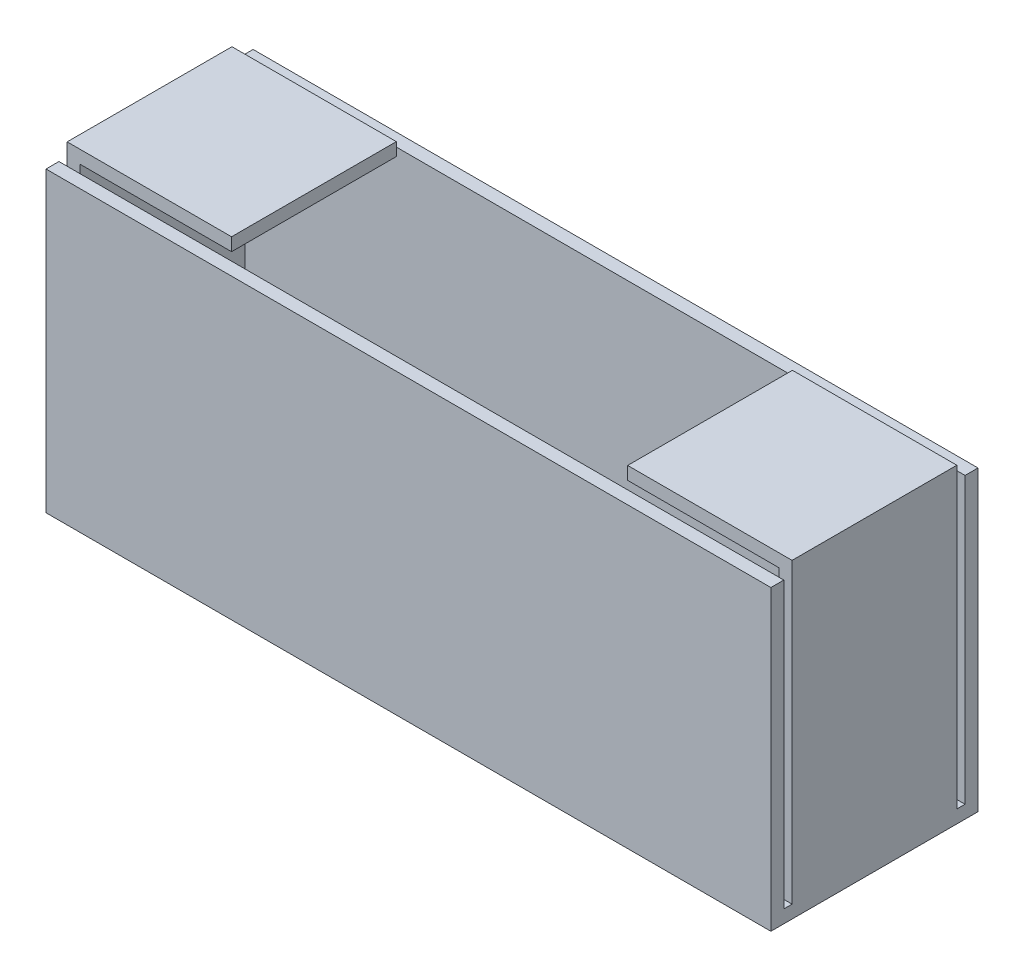
ISO-10303-21;
HEADER;
FILE_DESCRIPTION(('STEP AP214'),'2;1');
FILE_NAME('part.step','',(''),(''),'','','');
FILE_SCHEMA(('AUTOMOTIVE_DESIGN { 1 0 10303 214 1 1 1 1 }'));
ENDSEC;
DATA;
#1=APPLICATION_CONTEXT('core data for automotive mechanical design processes');
#2=APPLICATION_PROTOCOL_DEFINITION('international standard','automotive_design',2000,#1);
#3=PRODUCT_CONTEXT('',#1,'mechanical');
#4=PRODUCT('Part','Part','',(#3));
#5=PRODUCT_RELATED_PRODUCT_CATEGORY('part','',(#4));
#6=PRODUCT_DEFINITION_FORMATION('','',#4);
#7=PRODUCT_DEFINITION_CONTEXT('part definition',#1,'design');
#8=PRODUCT_DEFINITION('design','',#6,#7);
#9=PRODUCT_DEFINITION_SHAPE('','',#8);
#10=(LENGTH_UNIT() NAMED_UNIT(*) SI_UNIT(.MILLI.,.METRE.));
#11=(NAMED_UNIT(*) PLANE_ANGLE_UNIT() SI_UNIT($,.RADIAN.));
#12=(NAMED_UNIT(*) SI_UNIT($,.STERADIAN.) SOLID_ANGLE_UNIT());
#13=UNCERTAINTY_MEASURE_WITH_UNIT(LENGTH_MEASURE(1.E-05),#10,'distance_accuracy_value','');
#14=(GEOMETRIC_REPRESENTATION_CONTEXT(3) GLOBAL_UNCERTAINTY_ASSIGNED_CONTEXT((#13)) GLOBAL_UNIT_ASSIGNED_CONTEXT((#10,
#11,#12)) REPRESENTATION_CONTEXT('',''));
#15=CARTESIAN_POINT('',(0.,0.,0.));
#16=DIRECTION('',(0.,0.,1.));
#17=DIRECTION('',(1.,0.,0.));
#18=AXIS2_PLACEMENT_3D('',#15,#16,#17);
#19=CARTESIAN_POINT('',(0.,1.,0.));
#20=DIRECTION('',(0.,-1.,0.));
#21=DIRECTION('',(0.,0.,-1.));
#22=AXIS2_PLACEMENT_3D('',#19,#20,#21);
#23=PLANE('',#22);
#24=DIRECTION('',(1.,0.,0.));
#25=VECTOR('',#24,1.);
#26=CARTESIAN_POINT('',(-28.,1.,6.365));
#27=LINE('',#26,#25);
#28=CARTESIAN_POINT('',(-28.,1.,6.365));
#29=VERTEX_POINT('',#28);
#30=CARTESIAN_POINT('',(-27.,1.,6.365));
#31=VERTEX_POINT('',#30);
#32=EDGE_CURVE('E237',#29,#31,#27,.T.);
#33=ORIENTED_EDGE('',*,*,#32,.F.);
#34=DIRECTION('',(0.,0.,1.));
#35=VECTOR('',#34,1.);
#36=CARTESIAN_POINT('',(-28.,1.,8.));
#37=LINE('',#36,#35);
#38=CARTESIAN_POINT('',(-28.,1.,7.));
#39=VERTEX_POINT('',#38);
#40=EDGE_CURVE('E37',#29,#39,#37,.T.);
#41=ORIENTED_EDGE('',*,*,#40,.T.);
#42=DIRECTION('',(1.,0.,0.));
#43=VECTOR('',#42,1.);
#44=CARTESIAN_POINT('',(0.,1.,7.));
#45=LINE('',#44,#43);
#46=CARTESIAN_POINT('',(28.,1.,7.));
#47=VERTEX_POINT('',#46);
#48=EDGE_CURVE('E292',#39,#47,#45,.T.);
#49=ORIENTED_EDGE('',*,*,#48,.T.);
#50=DIRECTION('',(0.,0.,-1.));
#51=VECTOR('',#50,1.);
#52=CARTESIAN_POINT('',(28.,1.,8.));
#53=LINE('',#52,#51);
#54=CARTESIAN_POINT('',(28.,1.,6.365));
#55=VERTEX_POINT('',#54);
#56=EDGE_CURVE('E312',#47,#55,#53,.T.);
#57=ORIENTED_EDGE('',*,*,#56,.T.);
#58=DIRECTION('',(1.,0.,0.));
#59=VECTOR('',#58,1.);
#60=CARTESIAN_POINT('',(28.,1.,6.365));
#61=LINE('',#60,#59);
#62=CARTESIAN_POINT('',(27.,1.,6.365));
#63=VERTEX_POINT('',#62);
#64=EDGE_CURVE('E261',#63,#55,#61,.T.);
#65=ORIENTED_EDGE('',*,*,#64,.F.);
#66=DIRECTION('',(0.,0.,1.));
#67=VECTOR('',#66,1.);
#68=CARTESIAN_POINT('',(27.,1.,-6.365));
#69=LINE('',#68,#67);
#70=CARTESIAN_POINT('',(27.,1.,-6.365));
#71=VERTEX_POINT('',#70);
#72=EDGE_CURVE('E263',#71,#63,#69,.T.);
#73=ORIENTED_EDGE('',*,*,#72,.F.);
#74=DIRECTION('',(-1.,0.,0.));
#75=VECTOR('',#74,1.);
#76=CARTESIAN_POINT('',(28.,1.,-6.365));
#77=LINE('',#76,#75);
#78=CARTESIAN_POINT('',(28.,1.,-6.365));
#79=VERTEX_POINT('',#78);
#80=EDGE_CURVE('E256',#79,#71,#77,.T.);
#81=ORIENTED_EDGE('',*,*,#80,.F.);
#82=CARTESIAN_POINT('',(28.,1.,-7.));
#83=VERTEX_POINT('',#82);
#84=EDGE_CURVE('E180',#79,#83,#53,.T.);
#85=ORIENTED_EDGE('',*,*,#84,.T.);
#86=DIRECTION('',(-1.,0.,0.));
#87=VECTOR('',#86,1.);
#88=CARTESIAN_POINT('',(0.,1.,-7.00000000000002));
#89=LINE('',#88,#87);
#90=CARTESIAN_POINT('',(-28.,1.,-7.));
#91=VERTEX_POINT('',#90);
#92=EDGE_CURVE('E183',#83,#91,#89,.T.);
#93=ORIENTED_EDGE('',*,*,#92,.T.);
#94=CARTESIAN_POINT('',(-28.,1.,-6.365));
#95=VERTEX_POINT('',#94);
#96=EDGE_CURVE('E322',#91,#95,#37,.T.);
#97=ORIENTED_EDGE('',*,*,#96,.T.);
#98=DIRECTION('',(-1.,0.,0.));
#99=VECTOR('',#98,1.);
#100=CARTESIAN_POINT('',(-28.,1.,-6.365));
#101=LINE('',#100,#99);
#102=CARTESIAN_POINT('',(-27.,1.,-6.365));
#103=VERTEX_POINT('',#102);
#104=EDGE_CURVE('E56',#103,#95,#101,.T.);
#105=ORIENTED_EDGE('',*,*,#104,.F.);
#106=DIRECTION('',(0.,0.,-1.));
#107=VECTOR('',#106,1.);
#108=CARTESIAN_POINT('',(-27.,1.,-6.365));
#109=LINE('',#108,#107);
#110=EDGE_CURVE('E51',#31,#103,#109,.T.);
#111=ORIENTED_EDGE('',*,*,#110,.F.);
#112=EDGE_LOOP('',(#33,#41,#49,#57,#65,#73,#81,#85,#93,#97,#105,#111));
#113=FACE_BOUND('',#112,.T.);
#114=ADVANCED_FACE('F33',(#113),#23,.F.);
#115=CARTESIAN_POINT('',(28.,1.,8.));
#116=DIRECTION('',(-1.,0.,0.));
#117=DIRECTION('',(0.,0.,1.));
#118=AXIS2_PLACEMENT_3D('',#115,#116,#117);
#119=PLANE('',#118);
#120=DIRECTION('',(0.,0.,-1.));
#121=VECTOR('',#120,1.);
#122=CARTESIAN_POINT('',(28.,0.,8.));
#123=LINE('',#122,#121);
#124=CARTESIAN_POINT('',(28.,0.,8.));
#125=VERTEX_POINT('',#124);
#126=CARTESIAN_POINT('',(28.,0.,-8.));
#127=VERTEX_POINT('',#126);
#128=EDGE_CURVE('E319',#125,#127,#123,.T.);
#129=ORIENTED_EDGE('',*,*,#128,.T.);
#130=DIRECTION('',(0.,-1.,0.));
#131=VECTOR('',#130,1.);
#132=CARTESIAN_POINT('',(28.,1.,-8.));
#133=LINE('',#132,#131);
#134=CARTESIAN_POINT('',(28.,23.,-8.));
#135=VERTEX_POINT('',#134);
#136=EDGE_CURVE('E11',#135,#127,#133,.T.);
#137=ORIENTED_EDGE('',*,*,#136,.F.);
#138=DIRECTION('',(0.,0.,-1.));
#139=VECTOR('',#138,1.);
#140=CARTESIAN_POINT('',(28.,23.,0.));
#141=LINE('',#140,#139);
#142=CARTESIAN_POINT('',(28.,23.,-7.));
#143=VERTEX_POINT('',#142);
#144=EDGE_CURVE('E277',#143,#135,#141,.T.);
#145=ORIENTED_EDGE('',*,*,#144,.F.);
#146=DIRECTION('',(0.,-1.,0.));
#147=VECTOR('',#146,1.);
#148=CARTESIAN_POINT('',(28.,23.,-7.));
#149=LINE('',#148,#147);
#150=EDGE_CURVE('E290',#143,#83,#149,.T.);
#151=ORIENTED_EDGE('',*,*,#150,.T.);
#152=ORIENTED_EDGE('',*,*,#84,.F.);
#153=DIRECTION('',(0.,-1.,0.));
#154=VECTOR('',#153,1.);
#155=CARTESIAN_POINT('',(28.,23.,-6.365));
#156=LINE('',#155,#154);
#157=CARTESIAN_POINT('',(28.,24.,-6.365));
#158=VERTEX_POINT('',#157);
#159=EDGE_CURVE('E173',#158,#79,#156,.T.);
#160=ORIENTED_EDGE('',*,*,#159,.F.);
#161=DIRECTION('',(0.,0.,-1.));
#162=VECTOR('',#161,1.);
#163=CARTESIAN_POINT('',(28.,24.,-6.365));
#164=LINE('',#163,#162);
#165=CARTESIAN_POINT('',(28.,24.,6.365));
#166=VERTEX_POINT('',#165);
#167=EDGE_CURVE('E178',#166,#158,#164,.T.);
#168=ORIENTED_EDGE('',*,*,#167,.F.);
#169=DIRECTION('',(0.,-1.,0.));
#170=VECTOR('',#169,1.);
#171=CARTESIAN_POINT('',(28.,23.,6.365));
#172=LINE('',#171,#170);
#173=EDGE_CURVE('E260',#166,#55,#172,.T.);
#174=ORIENTED_EDGE('',*,*,#173,.T.);
#175=ORIENTED_EDGE('',*,*,#56,.F.);
#176=DIRECTION('',(0.,-1.,0.));
#177=VECTOR('',#176,1.);
#178=CARTESIAN_POINT('',(28.,23.,7.));
#179=LINE('',#178,#177);
#180=CARTESIAN_POINT('',(28.,23.,7.));
#181=VERTEX_POINT('',#180);
#182=EDGE_CURVE('E304',#181,#47,#179,.T.);
#183=ORIENTED_EDGE('',*,*,#182,.F.);
#184=DIRECTION('',(0.,0.,-1.));
#185=VECTOR('',#184,1.);
#186=CARTESIAN_POINT('',(28.,23.,0.));
#187=LINE('',#186,#185);
#188=CARTESIAN_POINT('',(28.,23.,8.));
#189=VERTEX_POINT('',#188);
#190=EDGE_CURVE('E302',#189,#181,#187,.T.);
#191=ORIENTED_EDGE('',*,*,#190,.F.);
#192=DIRECTION('',(0.,-1.,0.));
#193=VECTOR('',#192,1.);
#194=CARTESIAN_POINT('',(28.,1.,8.));
#195=LINE('',#194,#193);
#196=EDGE_CURVE('E323',#189,#125,#195,.T.);
#197=ORIENTED_EDGE('',*,*,#196,.T.);
#198=EDGE_LOOP('',(#129,#137,#145,#151,#152,#160,#168,#174,#175,#183,#191,#197));
#199=FACE_BOUND('',#198,.T.);
#200=ADVANCED_FACE('F35',(#199),#119,.F.);
#201=CARTESIAN_POINT('',(-28.,1.,-8.));
#202=DIRECTION('',(0.,0.,1.));
#203=DIRECTION('',(1.,0.,0.));
#204=AXIS2_PLACEMENT_3D('',#201,#202,#203);
#205=PLANE('',#204);
#206=DIRECTION('',(-1.,0.,0.));
#207=VECTOR('',#206,1.);
#208=CARTESIAN_POINT('',(-28.,0.,-8.));
#209=LINE('',#208,#207);
#210=CARTESIAN_POINT('',(-28.,0.,-8.));
#211=VERTEX_POINT('',#210);
#212=EDGE_CURVE('E328',#127,#211,#209,.T.);
#213=ORIENTED_EDGE('',*,*,#212,.T.);
#214=DIRECTION('',(0.,-1.,0.));
#215=VECTOR('',#214,1.);
#216=CARTESIAN_POINT('',(-28.,1.,-8.));
#217=LINE('',#216,#215);
#218=CARTESIAN_POINT('',(-28.,23.,-8.));
#219=VERTEX_POINT('',#218);
#220=EDGE_CURVE('E43',#219,#211,#217,.T.);
#221=ORIENTED_EDGE('',*,*,#220,.F.);
#222=DIRECTION('',(-1.,0.,0.));
#223=VECTOR('',#222,1.);
#224=CARTESIAN_POINT('',(0.,23.,-8.));
#225=LINE('',#224,#223);
#226=EDGE_CURVE('E280',#135,#219,#225,.T.);
#227=ORIENTED_EDGE('',*,*,#226,.F.);
#228=ORIENTED_EDGE('',*,*,#136,.T.);
#229=EDGE_LOOP('',(#213,#221,#227,#228));
#230=FACE_BOUND('',#229,.T.);
#231=ADVANCED_FACE('F411',(#230),#205,.F.);
#232=CARTESIAN_POINT('',(-28.,1.,8.));
#233=DIRECTION('',(1.,0.,0.));
#234=DIRECTION('',(0.,0.,-1.));
#235=AXIS2_PLACEMENT_3D('',#232,#233,#234);
#236=PLANE('',#235);
#237=DIRECTION('',(0.,0.,1.));
#238=VECTOR('',#237,1.);
#239=CARTESIAN_POINT('',(-28.,0.,8.));
#240=LINE('',#239,#238);
#241=CARTESIAN_POINT('',(-28.,0.,8.));
#242=VERTEX_POINT('',#241);
#243=EDGE_CURVE('E330',#211,#242,#240,.T.);
#244=ORIENTED_EDGE('',*,*,#243,.T.);
#245=DIRECTION('',(0.,-1.,0.));
#246=VECTOR('',#245,1.);
#247=CARTESIAN_POINT('',(-28.,1.,8.));
#248=LINE('',#247,#246);
#249=CARTESIAN_POINT('',(-28.,23.,8.));
#250=VERTEX_POINT('',#249);
#251=EDGE_CURVE('E336',#250,#242,#248,.T.);
#252=ORIENTED_EDGE('',*,*,#251,.F.);
#253=DIRECTION('',(0.,0.,1.));
#254=VECTOR('',#253,1.);
#255=CARTESIAN_POINT('',(-28.,23.,0.));
#256=LINE('',#255,#254);
#257=CARTESIAN_POINT('',(-28.,23.,7.));
#258=VERTEX_POINT('',#257);
#259=EDGE_CURVE('E296',#258,#250,#256,.T.);
#260=ORIENTED_EDGE('',*,*,#259,.F.);
#261=DIRECTION('',(0.,-1.,0.));
#262=VECTOR('',#261,1.);
#263=CARTESIAN_POINT('',(-28.,23.,7.));
#264=LINE('',#263,#262);
#265=EDGE_CURVE('E314',#258,#39,#264,.T.);
#266=ORIENTED_EDGE('',*,*,#265,.T.);
#267=ORIENTED_EDGE('',*,*,#40,.F.);
#268=DIRECTION('',(0.,-1.,0.));
#269=VECTOR('',#268,1.);
#270=CARTESIAN_POINT('',(-28.,23.,6.365));
#271=LINE('',#270,#269);
#272=CARTESIAN_POINT('',(-28.,24.,6.365));
#273=VERTEX_POINT('',#272);
#274=EDGE_CURVE('E253',#273,#29,#271,.T.);
#275=ORIENTED_EDGE('',*,*,#274,.F.);
#276=DIRECTION('',(0.,0.,1.));
#277=VECTOR('',#276,1.);
#278=CARTESIAN_POINT('',(-28.,24.,6.365));
#279=LINE('',#278,#277);
#280=CARTESIAN_POINT('',(-28.,24.,-6.365));
#281=VERTEX_POINT('',#280);
#282=EDGE_CURVE('E215',#281,#273,#279,.T.);
#283=ORIENTED_EDGE('',*,*,#282,.F.);
#284=DIRECTION('',(0.,-1.,0.));
#285=VECTOR('',#284,1.);
#286=CARTESIAN_POINT('',(-28.,23.,-6.365));
#287=LINE('',#286,#285);
#288=EDGE_CURVE('E241',#281,#95,#287,.T.);
#289=ORIENTED_EDGE('',*,*,#288,.T.);
#290=ORIENTED_EDGE('',*,*,#96,.F.);
#291=DIRECTION('',(0.,-1.,0.));
#292=VECTOR('',#291,1.);
#293=CARTESIAN_POINT('',(-28.,23.,-7.));
#294=LINE('',#293,#292);
#295=CARTESIAN_POINT('',(-28.,23.,-7.));
#296=VERTEX_POINT('',#295);
#297=EDGE_CURVE('E285',#296,#91,#294,.T.);
#298=ORIENTED_EDGE('',*,*,#297,.F.);
#299=DIRECTION('',(0.,0.,1.));
#300=VECTOR('',#299,1.);
#301=CARTESIAN_POINT('',(-28.,23.,0.));
#302=LINE('',#301,#300);
#303=EDGE_CURVE('E283',#219,#296,#302,.T.);
#304=ORIENTED_EDGE('',*,*,#303,.F.);
#305=ORIENTED_EDGE('',*,*,#220,.T.);
#306=EDGE_LOOP('',(#244,#252,#260,#266,#267,#275,#283,#289,#290,#298,#304,#305));
#307=FACE_BOUND('',#306,.T.);
#308=ADVANCED_FACE('F343',(#307),#236,.F.);
#309=CARTESIAN_POINT('',(-28.,1.,8.));
#310=DIRECTION('',(0.,0.,-1.));
#311=DIRECTION('',(-1.,0.,0.));
#312=AXIS2_PLACEMENT_3D('',#309,#310,#311);
#313=PLANE('',#312);
#314=DIRECTION('',(1.,0.,0.));
#315=VECTOR('',#314,1.);
#316=CARTESIAN_POINT('',(-28.,0.,8.));
#317=LINE('',#316,#315);
#318=EDGE_CURVE('E332',#242,#125,#317,.T.);
#319=ORIENTED_EDGE('',*,*,#318,.T.);
#320=ORIENTED_EDGE('',*,*,#196,.F.);
#321=DIRECTION('',(1.,0.,0.));
#322=VECTOR('',#321,1.);
#323=CARTESIAN_POINT('',(0.,23.,8.));
#324=LINE('',#323,#322);
#325=EDGE_CURVE('E299',#250,#189,#324,.T.);
#326=ORIENTED_EDGE('',*,*,#325,.F.);
#327=ORIENTED_EDGE('',*,*,#251,.T.);
#328=EDGE_LOOP('',(#319,#320,#326,#327));
#329=FACE_BOUND('',#328,.T.);
#330=ADVANCED_FACE('F352',(#329),#313,.F.);
#331=CARTESIAN_POINT('',(0.,0.,0.));
#332=DIRECTION('',(0.,-1.,0.));
#333=DIRECTION('',(0.,0.,-1.));
#334=AXIS2_PLACEMENT_3D('',#331,#332,#333);
#335=PLANE('',#334);
#336=ORIENTED_EDGE('',*,*,#128,.F.);
#337=ORIENTED_EDGE('',*,*,#318,.F.);
#338=ORIENTED_EDGE('',*,*,#243,.F.);
#339=ORIENTED_EDGE('',*,*,#212,.F.);
#340=EDGE_LOOP('',(#336,#337,#338,#339));
#341=FACE_BOUND('',#340,.T.);
#342=ADVANCED_FACE('F350',(#341),#335,.T.);
#343=CARTESIAN_POINT('',(0.,23.,7.));
#344=DIRECTION('',(0.,0.,-1.));
#345=DIRECTION('',(-1.,0.,0.));
#346=AXIS2_PLACEMENT_3D('',#343,#344,#345);
#347=PLANE('',#346);
#348=ORIENTED_EDGE('',*,*,#48,.F.);
#349=ORIENTED_EDGE('',*,*,#265,.F.);
#350=DIRECTION('',(1.,0.,0.));
#351=VECTOR('',#350,1.);
#352=CARTESIAN_POINT('',(0.,23.,7.));
#353=LINE('',#352,#351);
#354=EDGE_CURVE('E293',#258,#181,#353,.T.);
#355=ORIENTED_EDGE('',*,*,#354,.T.);
#356=ORIENTED_EDGE('',*,*,#182,.T.);
#357=EDGE_LOOP('',(#348,#349,#355,#356));
#358=FACE_BOUND('',#357,.T.);
#359=ADVANCED_FACE('F363',(#358),#347,.T.);
#360=CARTESIAN_POINT('',(0.,23.,0.));
#361=DIRECTION('',(0.,1.,0.));
#362=DIRECTION('',(0.,0.,1.));
#363=AXIS2_PLACEMENT_3D('',#360,#361,#362);
#364=PLANE('',#363);
#365=ORIENTED_EDGE('',*,*,#354,.F.);
#366=ORIENTED_EDGE('',*,*,#259,.T.);
#367=ORIENTED_EDGE('',*,*,#325,.T.);
#368=ORIENTED_EDGE('',*,*,#190,.T.);
#369=EDGE_LOOP('',(#365,#366,#367,#368));
#370=FACE_BOUND('',#369,.T.);
#371=ADVANCED_FACE('F359',(#370),#364,.T.);
#372=CARTESIAN_POINT('',(0.,23.,-7.00000000000002));
#373=DIRECTION('',(0.,0.,1.));
#374=DIRECTION('',(1.,0.,0.));
#375=AXIS2_PLACEMENT_3D('',#372,#373,#374);
#376=PLANE('',#375);
#377=ORIENTED_EDGE('',*,*,#92,.F.);
#378=ORIENTED_EDGE('',*,*,#150,.F.);
#379=DIRECTION('',(-1.,0.,0.));
#380=VECTOR('',#379,1.);
#381=CARTESIAN_POINT('',(0.,23.,-7.00000000000002));
#382=LINE('',#381,#380);
#383=EDGE_CURVE('E274',#143,#296,#382,.T.);
#384=ORIENTED_EDGE('',*,*,#383,.T.);
#385=ORIENTED_EDGE('',*,*,#297,.T.);
#386=EDGE_LOOP('',(#377,#378,#384,#385));
#387=FACE_BOUND('',#386,.T.);
#388=ADVANCED_FACE('F368',(#387),#376,.T.);
#389=CARTESIAN_POINT('',(0.,23.,0.));
#390=DIRECTION('',(0.,1.,0.));
#391=DIRECTION('',(0.,0.,1.));
#392=AXIS2_PLACEMENT_3D('',#389,#390,#391);
#393=PLANE('',#392);
#394=ORIENTED_EDGE('',*,*,#383,.F.);
#395=ORIENTED_EDGE('',*,*,#144,.T.);
#396=ORIENTED_EDGE('',*,*,#226,.T.);
#397=ORIENTED_EDGE('',*,*,#303,.T.);
#398=EDGE_LOOP('',(#394,#395,#396,#397));
#399=FACE_BOUND('',#398,.T.);
#400=ADVANCED_FACE('F424',(#399),#393,.T.);
#401=CARTESIAN_POINT('',(28.,23.,-6.365));
#402=DIRECTION('',(0.,0.,1.));
#403=DIRECTION('',(1.,0.,0.));
#404=AXIS2_PLACEMENT_3D('',#401,#402,#403);
#405=PLANE('',#404);
#406=ORIENTED_EDGE('',*,*,#80,.T.);
#407=DIRECTION('',(0.,-1.,0.));
#408=VECTOR('',#407,1.);
#409=CARTESIAN_POINT('',(27.,23.,-6.365));
#410=LINE('',#409,#408);
#411=CARTESIAN_POINT('',(27.,23.,-6.365));
#412=VERTEX_POINT('',#411);
#413=EDGE_CURVE('E184',#412,#71,#410,.T.);
#414=ORIENTED_EDGE('',*,*,#413,.F.);
#415=DIRECTION('',(-1.,0.,0.));
#416=VECTOR('',#415,1.);
#417=CARTESIAN_POINT('',(28.,23.,-6.365));
#418=LINE('',#417,#416);
#419=CARTESIAN_POINT('',(15.3,23.,-6.365));
#420=VERTEX_POINT('',#419);
#421=EDGE_CURVE('E208',#412,#420,#418,.T.);
#422=ORIENTED_EDGE('',*,*,#421,.T.);
#423=DIRECTION('',(0.,-1.,0.));
#424=VECTOR('',#423,1.);
#425=CARTESIAN_POINT('',(15.3,24.,-6.365));
#426=LINE('',#425,#424);
#427=CARTESIAN_POINT('',(15.3,24.,-6.365));
#428=VERTEX_POINT('',#427);
#429=EDGE_CURVE('E190',#428,#420,#426,.T.);
#430=ORIENTED_EDGE('',*,*,#429,.F.);
#431=DIRECTION('',(-1.,0.,0.));
#432=VECTOR('',#431,1.);
#433=CARTESIAN_POINT('',(28.,24.,-6.365));
#434=LINE('',#433,#432);
#435=EDGE_CURVE('E187',#158,#428,#434,.T.);
#436=ORIENTED_EDGE('',*,*,#435,.F.);
#437=ORIENTED_EDGE('',*,*,#159,.T.);
#438=EDGE_LOOP('',(#406,#414,#422,#430,#436,#437));
#439=FACE_BOUND('',#438,.T.);
#440=ADVANCED_FACE('F188',(#439),#405,.F.);
#441=CARTESIAN_POINT('',(27.,23.,-6.365));
#442=DIRECTION('',(1.,0.,0.));
#443=DIRECTION('',(0.,0.,-1.));
#444=AXIS2_PLACEMENT_3D('',#441,#442,#443);
#445=PLANE('',#444);
#446=ORIENTED_EDGE('',*,*,#72,.T.);
#447=DIRECTION('',(0.,-1.,0.));
#448=VECTOR('',#447,1.);
#449=CARTESIAN_POINT('',(27.,23.,6.365));
#450=LINE('',#449,#448);
#451=CARTESIAN_POINT('',(27.,23.,6.365));
#452=VERTEX_POINT('',#451);
#453=EDGE_CURVE('E269',#452,#63,#450,.T.);
#454=ORIENTED_EDGE('',*,*,#453,.F.);
#455=DIRECTION('',(0.,0.,1.));
#456=VECTOR('',#455,1.);
#457=CARTESIAN_POINT('',(27.,23.,-6.365));
#458=LINE('',#457,#456);
#459=EDGE_CURVE('E257',#412,#452,#458,.T.);
#460=ORIENTED_EDGE('',*,*,#459,.F.);
#461=ORIENTED_EDGE('',*,*,#413,.T.);
#462=EDGE_LOOP('',(#446,#454,#460,#461));
#463=FACE_BOUND('',#462,.T.);
#464=ADVANCED_FACE('F430',(#463),#445,.F.);
#465=CARTESIAN_POINT('',(28.,23.,6.365));
#466=DIRECTION('',(0.,0.,-1.));
#467=DIRECTION('',(-1.,0.,0.));
#468=AXIS2_PLACEMENT_3D('',#465,#466,#467);
#469=PLANE('',#468);
#470=ORIENTED_EDGE('',*,*,#64,.T.);
#471=ORIENTED_EDGE('',*,*,#173,.F.);
#472=DIRECTION('',(1.,0.,0.));
#473=VECTOR('',#472,1.);
#474=CARTESIAN_POINT('',(28.,24.,6.365));
#475=LINE('',#474,#473);
#476=CARTESIAN_POINT('',(15.3,24.,6.365));
#477=VERTEX_POINT('',#476);
#478=EDGE_CURVE('E198',#477,#166,#475,.T.);
#479=ORIENTED_EDGE('',*,*,#478,.F.);
#480=DIRECTION('',(0.,-1.,0.));
#481=VECTOR('',#480,1.);
#482=CARTESIAN_POINT('',(15.3,24.,6.365));
#483=LINE('',#482,#481);
#484=CARTESIAN_POINT('',(15.3,23.,6.365));
#485=VERTEX_POINT('',#484);
#486=EDGE_CURVE('E207',#477,#485,#483,.T.);
#487=ORIENTED_EDGE('',*,*,#486,.T.);
#488=DIRECTION('',(1.,0.,0.));
#489=VECTOR('',#488,1.);
#490=CARTESIAN_POINT('',(28.,23.,6.365));
#491=LINE('',#490,#489);
#492=EDGE_CURVE('E199',#485,#452,#491,.T.);
#493=ORIENTED_EDGE('',*,*,#492,.T.);
#494=ORIENTED_EDGE('',*,*,#453,.T.);
#495=EDGE_LOOP('',(#470,#471,#479,#487,#493,#494));
#496=FACE_BOUND('',#495,.T.);
#497=ADVANCED_FACE('F468',(#496),#469,.F.);
#498=CARTESIAN_POINT('',(-28.,23.,6.365));
#499=DIRECTION('',(0.,0.,-1.));
#500=DIRECTION('',(-1.,0.,0.));
#501=AXIS2_PLACEMENT_3D('',#498,#499,#500);
#502=PLANE('',#501);
#503=ORIENTED_EDGE('',*,*,#32,.T.);
#504=DIRECTION('',(0.,-1.,0.));
#505=VECTOR('',#504,1.);
#506=CARTESIAN_POINT('',(-27.,23.,6.365));
#507=LINE('',#506,#505);
#508=CARTESIAN_POINT('',(-27.,23.,6.365));
#509=VERTEX_POINT('',#508);
#510=EDGE_CURVE('E250',#509,#31,#507,.T.);
#511=ORIENTED_EDGE('',*,*,#510,.F.);
#512=DIRECTION('',(1.,0.,0.));
#513=VECTOR('',#512,1.);
#514=CARTESIAN_POINT('',(-28.,23.,6.365));
#515=LINE('',#514,#513);
#516=CARTESIAN_POINT('',(-15.3,23.,6.365));
#517=VERTEX_POINT('',#516);
#518=EDGE_CURVE('E214',#509,#517,#515,.T.);
#519=ORIENTED_EDGE('',*,*,#518,.T.);
#520=DIRECTION('',(0.,-1.,0.));
#521=VECTOR('',#520,1.);
#522=CARTESIAN_POINT('',(-15.3,24.,6.365));
#523=LINE('',#522,#521);
#524=CARTESIAN_POINT('',(-15.3,24.,6.365));
#525=VERTEX_POINT('',#524);
#526=EDGE_CURVE('E234',#525,#517,#523,.T.);
#527=ORIENTED_EDGE('',*,*,#526,.F.);
#528=DIRECTION('',(1.,0.,0.));
#529=VECTOR('',#528,1.);
#530=CARTESIAN_POINT('',(-28.,24.,6.365));
#531=LINE('',#530,#529);
#532=EDGE_CURVE('E218',#273,#525,#531,.T.);
#533=ORIENTED_EDGE('',*,*,#532,.F.);
#534=ORIENTED_EDGE('',*,*,#274,.T.);
#535=EDGE_LOOP('',(#503,#511,#519,#527,#533,#534));
#536=FACE_BOUND('',#535,.T.);
#537=ADVANCED_FACE('F383',(#536),#502,.F.);
#538=CARTESIAN_POINT('',(-27.,23.,-6.365));
#539=DIRECTION('',(-1.,0.,0.));
#540=DIRECTION('',(0.,0.,1.));
#541=AXIS2_PLACEMENT_3D('',#538,#539,#540);
#542=PLANE('',#541);
#543=ORIENTED_EDGE('',*,*,#110,.T.);
#544=DIRECTION('',(0.,-1.,0.));
#545=VECTOR('',#544,1.);
#546=CARTESIAN_POINT('',(-27.,23.,-6.365));
#547=LINE('',#546,#545);
#548=CARTESIAN_POINT('',(-27.,23.,-6.365));
#549=VERTEX_POINT('',#548);
#550=EDGE_CURVE('E247',#549,#103,#547,.T.);
#551=ORIENTED_EDGE('',*,*,#550,.F.);
#552=DIRECTION('',(0.,0.,-1.));
#553=VECTOR('',#552,1.);
#554=CARTESIAN_POINT('',(-27.,23.,-6.365));
#555=LINE('',#554,#553);
#556=EDGE_CURVE('E238',#509,#549,#555,.T.);
#557=ORIENTED_EDGE('',*,*,#556,.F.);
#558=ORIENTED_EDGE('',*,*,#510,.T.);
#559=EDGE_LOOP('',(#543,#551,#557,#558));
#560=FACE_BOUND('',#559,.T.);
#561=ADVANCED_FACE('F376',(#560),#542,.F.);
#562=CARTESIAN_POINT('',(-28.,23.,-6.365));
#563=DIRECTION('',(0.,0.,1.));
#564=DIRECTION('',(1.,0.,0.));
#565=AXIS2_PLACEMENT_3D('',#562,#563,#564);
#566=PLANE('',#565);
#567=ORIENTED_EDGE('',*,*,#104,.T.);
#568=ORIENTED_EDGE('',*,*,#288,.F.);
#569=DIRECTION('',(-1.,0.,0.));
#570=VECTOR('',#569,1.);
#571=CARTESIAN_POINT('',(-28.,24.,-6.365));
#572=LINE('',#571,#570);
#573=CARTESIAN_POINT('',(-15.3,24.,-6.365));
#574=VERTEX_POINT('',#573);
#575=EDGE_CURVE('E223',#574,#281,#572,.T.);
#576=ORIENTED_EDGE('',*,*,#575,.F.);
#577=DIRECTION('',(0.,-1.,0.));
#578=VECTOR('',#577,1.);
#579=CARTESIAN_POINT('',(-15.3,24.,-6.365));
#580=LINE('',#579,#578);
#581=CARTESIAN_POINT('',(-15.3,23.,-6.365));
#582=VERTEX_POINT('',#581);
#583=EDGE_CURVE('E226',#574,#582,#580,.T.);
#584=ORIENTED_EDGE('',*,*,#583,.T.);
#585=DIRECTION('',(-1.,0.,0.));
#586=VECTOR('',#585,1.);
#587=CARTESIAN_POINT('',(-28.,23.,-6.365));
#588=LINE('',#587,#586);
#589=EDGE_CURVE('E219',#582,#549,#588,.T.);
#590=ORIENTED_EDGE('',*,*,#589,.T.);
#591=ORIENTED_EDGE('',*,*,#550,.T.);
#592=EDGE_LOOP('',(#567,#568,#576,#584,#590,#591));
#593=FACE_BOUND('',#592,.T.);
#594=ADVANCED_FACE('F371',(#593),#566,.F.);
#595=CARTESIAN_POINT('',(0.,23.,0.));
#596=DIRECTION('',(0.,-1.,0.));
#597=DIRECTION('',(0.,0.,-1.));
#598=AXIS2_PLACEMENT_3D('',#595,#596,#597);
#599=PLANE('',#598);
#600=ORIENTED_EDGE('',*,*,#556,.T.);
#601=ORIENTED_EDGE('',*,*,#589,.F.);
#602=DIRECTION('',(0.,0.,-1.));
#603=VECTOR('',#602,1.);
#604=CARTESIAN_POINT('',(-15.3,23.,6.365));
#605=LINE('',#604,#603);
#606=EDGE_CURVE('E228',#517,#582,#605,.T.);
#607=ORIENTED_EDGE('',*,*,#606,.F.);
#608=ORIENTED_EDGE('',*,*,#518,.F.);
#609=EDGE_LOOP('',(#600,#601,#607,#608));
#610=FACE_BOUND('',#609,.T.);
#611=ADVANCED_FACE('F379',(#610),#599,.T.);
#612=CARTESIAN_POINT('',(-15.3,24.,6.365));
#613=DIRECTION('',(-1.,0.,0.));
#614=DIRECTION('',(0.,0.,1.));
#615=AXIS2_PLACEMENT_3D('',#612,#613,#614);
#616=PLANE('',#615);
#617=ORIENTED_EDGE('',*,*,#606,.T.);
#618=ORIENTED_EDGE('',*,*,#583,.F.);
#619=DIRECTION('',(0.,0.,-1.));
#620=VECTOR('',#619,1.);
#621=CARTESIAN_POINT('',(-15.3,24.,6.365));
#622=LINE('',#621,#620);
#623=EDGE_CURVE('E221',#525,#574,#622,.T.);
#624=ORIENTED_EDGE('',*,*,#623,.F.);
#625=ORIENTED_EDGE('',*,*,#526,.T.);
#626=EDGE_LOOP('',(#617,#618,#624,#625));
#627=FACE_BOUND('',#626,.T.);
#628=ADVANCED_FACE('F387',(#627),#616,.F.);
#629=CARTESIAN_POINT('',(0.,24.,0.));
#630=DIRECTION('',(0.,-1.,0.));
#631=DIRECTION('',(0.,0.,-1.));
#632=AXIS2_PLACEMENT_3D('',#629,#630,#631);
#633=PLANE('',#632);
#634=ORIENTED_EDGE('',*,*,#282,.T.);
#635=ORIENTED_EDGE('',*,*,#532,.T.);
#636=ORIENTED_EDGE('',*,*,#623,.T.);
#637=ORIENTED_EDGE('',*,*,#575,.T.);
#638=EDGE_LOOP('',(#634,#635,#636,#637));
#639=FACE_BOUND('',#638,.T.);
#640=ADVANCED_FACE('F390',(#639),#633,.F.);
#641=CARTESIAN_POINT('',(0.,23.,0.));
#642=DIRECTION('',(0.,-1.,0.));
#643=DIRECTION('',(0.,0.,-1.));
#644=AXIS2_PLACEMENT_3D('',#641,#642,#643);
#645=PLANE('',#644);
#646=ORIENTED_EDGE('',*,*,#459,.T.);
#647=ORIENTED_EDGE('',*,*,#492,.F.);
#648=DIRECTION('',(0.,0.,1.));
#649=VECTOR('',#648,1.);
#650=CARTESIAN_POINT('',(15.3,23.,6.365));
#651=LINE('',#650,#649);
#652=EDGE_CURVE('E202',#420,#485,#651,.T.);
#653=ORIENTED_EDGE('',*,*,#652,.F.);
#654=ORIENTED_EDGE('',*,*,#421,.F.);
#655=EDGE_LOOP('',(#646,#647,#653,#654));
#656=FACE_BOUND('',#655,.T.);
#657=ADVANCED_FACE('F392',(#656),#645,.T.);
#658=CARTESIAN_POINT('',(15.3,24.,6.365));
#659=DIRECTION('',(1.,0.,0.));
#660=DIRECTION('',(0.,0.,-1.));
#661=AXIS2_PLACEMENT_3D('',#658,#659,#660);
#662=PLANE('',#661);
#663=ORIENTED_EDGE('',*,*,#652,.T.);
#664=ORIENTED_EDGE('',*,*,#486,.F.);
#665=DIRECTION('',(0.,0.,1.));
#666=VECTOR('',#665,1.);
#667=CARTESIAN_POINT('',(15.3,24.,6.365));
#668=LINE('',#667,#666);
#669=EDGE_CURVE('E193',#428,#477,#668,.T.);
#670=ORIENTED_EDGE('',*,*,#669,.F.);
#671=ORIENTED_EDGE('',*,*,#429,.T.);
#672=EDGE_LOOP('',(#663,#664,#670,#671));
#673=FACE_BOUND('',#672,.T.);
#674=ADVANCED_FACE('F398',(#673),#662,.F.);
#675=CARTESIAN_POINT('',(0.,24.,0.));
#676=DIRECTION('',(0.,-1.,0.));
#677=DIRECTION('',(0.,0.,-1.));
#678=AXIS2_PLACEMENT_3D('',#675,#676,#677);
#679=PLANE('',#678);
#680=ORIENTED_EDGE('',*,*,#167,.T.);
#681=ORIENTED_EDGE('',*,*,#435,.T.);
#682=ORIENTED_EDGE('',*,*,#669,.T.);
#683=ORIENTED_EDGE('',*,*,#478,.T.);
#684=EDGE_LOOP('',(#680,#681,#682,#683));
#685=FACE_BOUND('',#684,.T.);
#686=ADVANCED_FACE('F196',(#685),#679,.F.);
#687=CLOSED_SHELL('',(#114,#200,#231,#308,#330,#342,#359,#371,#388,#400,#440,#464,#497,#537,
#561,#594,#611,#628,#640,#657,#674,#686));
#688=MANIFOLD_SOLID_BREP('B2',#687);
#689=ADVANCED_BREP_SHAPE_REPRESENTATION('',(#18,#688),#14);
#690=SHAPE_DEFINITION_REPRESENTATION(#9,#689);
ENDSEC;
END-ISO-10303-21;
